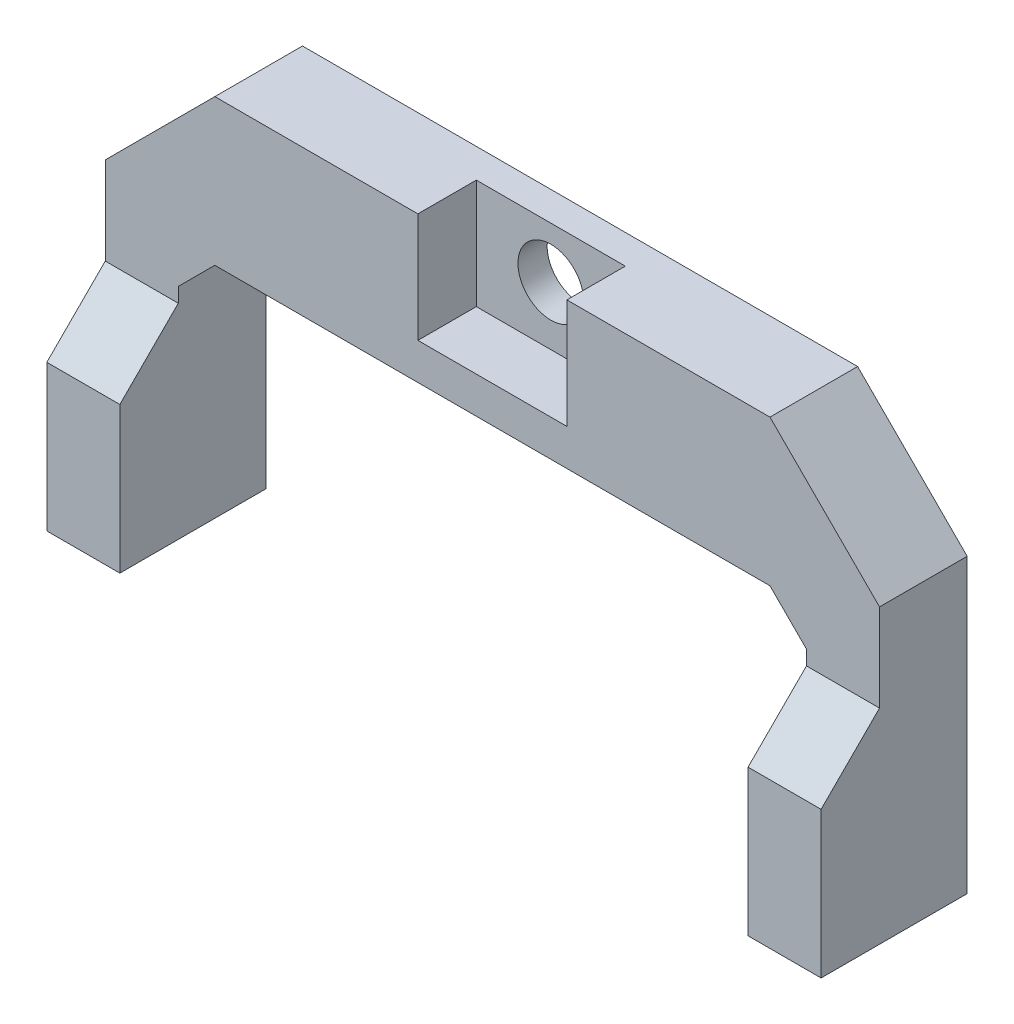
ISO-10303-21;
HEADER;
FILE_DESCRIPTION(('STEP AP214'),'2;1');
FILE_NAME('part.step','',(''),(''),'','','');
FILE_SCHEMA(('AUTOMOTIVE_DESIGN { 1 0 10303 214 1 1 1 1 }'));
ENDSEC;
DATA;
#1=APPLICATION_CONTEXT('core data for automotive mechanical design processes');
#2=APPLICATION_PROTOCOL_DEFINITION('international standard','automotive_design',2000,#1);
#3=PRODUCT_CONTEXT('',#1,'mechanical');
#4=PRODUCT('Part','Part','',(#3));
#5=PRODUCT_RELATED_PRODUCT_CATEGORY('part','',(#4));
#6=PRODUCT_DEFINITION_FORMATION('','',#4);
#7=PRODUCT_DEFINITION_CONTEXT('part definition',#1,'design');
#8=PRODUCT_DEFINITION('design','',#6,#7);
#9=PRODUCT_DEFINITION_SHAPE('','',#8);
#10=(LENGTH_UNIT() NAMED_UNIT(*) SI_UNIT(.MILLI.,.METRE.));
#11=(NAMED_UNIT(*) PLANE_ANGLE_UNIT() SI_UNIT($,.RADIAN.));
#12=(NAMED_UNIT(*) SI_UNIT($,.STERADIAN.) SOLID_ANGLE_UNIT());
#13=UNCERTAINTY_MEASURE_WITH_UNIT(LENGTH_MEASURE(1.E-05),#10,'distance_accuracy_value','');
#14=(GEOMETRIC_REPRESENTATION_CONTEXT(3) GLOBAL_UNCERTAINTY_ASSIGNED_CONTEXT((#13)) GLOBAL_UNIT_ASSIGNED_CONTEXT((#10,
#11,#12)) REPRESENTATION_CONTEXT('',''));
#15=CARTESIAN_POINT('',(0.,0.,0.));
#16=DIRECTION('',(0.,0.,1.));
#17=DIRECTION('',(1.,0.,0.));
#18=AXIS2_PLACEMENT_3D('',#15,#16,#17);
#19=CARTESIAN_POINT('',(-19.,0.,6.));
#20=DIRECTION('',(0.,-1.,0.));
#21=DIRECTION('',(0.,0.,-1.));
#22=AXIS2_PLACEMENT_3D('',#19,#20,#21);
#23=PLANE('',#22);
#24=DIRECTION('',(0.,0.,1.));
#25=VECTOR('',#24,1.);
#26=CARTESIAN_POINT('',(5.1,0.,2.));
#27=LINE('',#26,#25);
#28=CARTESIAN_POINT('',(5.1,0.,2.));
#29=VERTEX_POINT('',#28);
#30=CARTESIAN_POINT('',(5.1,0.,6.));
#31=VERTEX_POINT('',#30);
#32=EDGE_CURVE('E200',#29,#31,#27,.T.);
#33=ORIENTED_EDGE('',*,*,#32,.T.);
#34=DIRECTION('',(1.,0.,0.));
#35=VECTOR('',#34,1.);
#36=CARTESIAN_POINT('',(19.,0.,6.));
#37=LINE('',#36,#35);
#38=CARTESIAN_POINT('',(19.,0.,6.));
#39=VERTEX_POINT('',#38);
#40=EDGE_CURVE('E244',#31,#39,#37,.T.);
#41=ORIENTED_EDGE('',*,*,#40,.T.);
#42=DIRECTION('',(0.,0.,-1.));
#43=VECTOR('',#42,1.);
#44=CARTESIAN_POINT('',(19.,0.,6.));
#45=LINE('',#44,#43);
#46=CARTESIAN_POINT('',(19.,0.,0.));
#47=VERTEX_POINT('',#46);
#48=EDGE_CURVE('E247',#39,#47,#45,.T.);
#49=ORIENTED_EDGE('',*,*,#48,.T.);
#50=DIRECTION('',(-1.,0.,0.));
#51=VECTOR('',#50,1.);
#52=CARTESIAN_POINT('',(-19.,0.,0.));
#53=LINE('',#52,#51);
#54=CARTESIAN_POINT('',(-19.,0.,0.));
#55=VERTEX_POINT('',#54);
#56=EDGE_CURVE('E341',#47,#55,#53,.T.);
#57=ORIENTED_EDGE('',*,*,#56,.T.);
#58=DIRECTION('',(0.,0.,-1.));
#59=VECTOR('',#58,1.);
#60=CARTESIAN_POINT('',(-19.,0.,6.));
#61=LINE('',#60,#59);
#62=CARTESIAN_POINT('',(-19.,0.,6.));
#63=VERTEX_POINT('',#62);
#64=EDGE_CURVE('E377',#63,#55,#61,.T.);
#65=ORIENTED_EDGE('',*,*,#64,.F.);
#66=DIRECTION('',(-1.,0.,0.));
#67=VECTOR('',#66,1.);
#68=CARTESIAN_POINT('',(-19.,0.,6.));
#69=LINE('',#68,#67);
#70=CARTESIAN_POINT('',(-5.1,0.,6.));
#71=VERTEX_POINT('',#70);
#72=EDGE_CURVE('E321',#71,#63,#69,.T.);
#73=ORIENTED_EDGE('',*,*,#72,.F.);
#74=DIRECTION('',(0.,0.,1.));
#75=VECTOR('',#74,1.);
#76=CARTESIAN_POINT('',(-5.1,0.,2.));
#77=LINE('',#76,#75);
#78=CARTESIAN_POINT('',(-5.1,0.,2.));
#79=VERTEX_POINT('',#78);
#80=EDGE_CURVE('E191',#79,#71,#77,.T.);
#81=ORIENTED_EDGE('',*,*,#80,.F.);
#82=DIRECTION('',(-1.,0.,0.));
#83=VECTOR('',#82,1.);
#84=CARTESIAN_POINT('',(0.,0.,2.));
#85=LINE('',#84,#83);
#86=EDGE_CURVE('E286',#29,#79,#85,.T.);
#87=ORIENTED_EDGE('',*,*,#86,.F.);
#88=EDGE_LOOP('',(#33,#41,#49,#57,#65,#73,#81,#87));
#89=FACE_BOUND('',#88,.T.);
#90=ADVANCED_FACE('F41',(#89),#23,.F.);
#91=CARTESIAN_POINT('',(0.,0.,6.));
#92=DIRECTION('',(0.,0.,1.));
#93=DIRECTION('',(1.,0.,0.));
#94=AXIS2_PLACEMENT_3D('',#91,#92,#93);
#95=PLANE('',#94);
#96=DIRECTION('',(0.,1.,0.));
#97=VECTOR('',#96,1.);
#98=CARTESIAN_POINT('',(21.5,-12.5,6.));
#99=LINE('',#98,#97);
#100=CARTESIAN_POINT('',(21.5,-13.5,6.));
#101=VERTEX_POINT('',#100);
#102=CARTESIAN_POINT('',(21.5,-12.5,6.));
#103=VERTEX_POINT('',#102);
#104=EDGE_CURVE('E232',#101,#103,#99,.T.);
#105=ORIENTED_EDGE('',*,*,#104,.F.);
#106=DIRECTION('',(1.,0.,0.));
#107=VECTOR('',#106,1.);
#108=CARTESIAN_POINT('',(26.5,-13.5,6.));
#109=LINE('',#108,#107);
#110=CARTESIAN_POINT('',(26.5,-13.5,6.));
#111=VERTEX_POINT('',#110);
#112=EDGE_CURVE('E384',#101,#111,#109,.T.);
#113=ORIENTED_EDGE('',*,*,#112,.T.);
#114=DIRECTION('',(0.,-1.,0.));
#115=VECTOR('',#114,1.);
#116=CARTESIAN_POINT('',(26.5,-27.5,6.));
#117=LINE('',#116,#115);
#118=CARTESIAN_POINT('',(26.5,-7.49999999999998,6.));
#119=VERTEX_POINT('',#118);
#120=EDGE_CURVE('E236',#119,#111,#117,.T.);
#121=ORIENTED_EDGE('',*,*,#120,.F.);
#122=DIRECTION('',(0.707106781186549,-0.707106781186546,0.));
#123=VECTOR('',#122,1.);
#124=CARTESIAN_POINT('',(26.5,-7.49999999999998,6.));
#125=LINE('',#124,#123);
#126=EDGE_CURVE('E240',#39,#119,#125,.T.);
#127=ORIENTED_EDGE('',*,*,#126,.F.);
#128=ORIENTED_EDGE('',*,*,#40,.F.);
#129=DIRECTION('',(0.,-1.,0.));
#130=VECTOR('',#129,1.);
#131=CARTESIAN_POINT('',(5.1,0.,6.));
#132=LINE('',#131,#130);
#133=CARTESIAN_POINT('',(5.1,-7.5,6.));
#134=VERTEX_POINT('',#133);
#135=EDGE_CURVE('E202',#31,#134,#132,.T.);
#136=ORIENTED_EDGE('',*,*,#135,.T.);
#137=DIRECTION('',(1.,0.,0.));
#138=VECTOR('',#137,1.);
#139=CARTESIAN_POINT('',(0.,-7.5,6.));
#140=LINE('',#139,#138);
#141=CARTESIAN_POINT('',(-5.1,-7.5,6.));
#142=VERTEX_POINT('',#141);
#143=EDGE_CURVE('E206',#142,#134,#140,.T.);
#144=ORIENTED_EDGE('',*,*,#143,.F.);
#145=DIRECTION('',(0.,-1.,0.));
#146=VECTOR('',#145,1.);
#147=CARTESIAN_POINT('',(-5.1,0.,6.));
#148=LINE('',#147,#146);
#149=EDGE_CURVE('E285',#71,#142,#148,.T.);
#150=ORIENTED_EDGE('',*,*,#149,.F.);
#151=ORIENTED_EDGE('',*,*,#72,.T.);
#152=DIRECTION('',(-0.707106781186548,-0.707106781186547,0.));
#153=VECTOR('',#152,1.);
#154=CARTESIAN_POINT('',(-26.5,-7.49999999999999,6.));
#155=LINE('',#154,#153);
#156=CARTESIAN_POINT('',(-26.5,-7.49999999999999,6.));
#157=VERTEX_POINT('',#156);
#158=EDGE_CURVE('E325',#63,#157,#155,.T.);
#159=ORIENTED_EDGE('',*,*,#158,.T.);
#160=DIRECTION('',(0.,-1.,0.));
#161=VECTOR('',#160,1.);
#162=CARTESIAN_POINT('',(-26.5,-27.5,6.));
#163=LINE('',#162,#161);
#164=CARTESIAN_POINT('',(-26.5,-13.5,6.));
#165=VERTEX_POINT('',#164);
#166=EDGE_CURVE('E328',#157,#165,#163,.T.);
#167=ORIENTED_EDGE('',*,*,#166,.T.);
#168=DIRECTION('',(1.,0.,0.));
#169=VECTOR('',#168,1.);
#170=CARTESIAN_POINT('',(0.,-13.5,6.));
#171=LINE('',#170,#169);
#172=CARTESIAN_POINT('',(-21.5,-13.5,6.));
#173=VERTEX_POINT('',#172);
#174=EDGE_CURVE('E381',#165,#173,#171,.T.);
#175=ORIENTED_EDGE('',*,*,#174,.T.);
#176=DIRECTION('',(0.,1.,0.));
#177=VECTOR('',#176,1.);
#178=CARTESIAN_POINT('',(-21.5,-12.5,6.));
#179=LINE('',#178,#177);
#180=CARTESIAN_POINT('',(-21.5,-12.5,6.));
#181=VERTEX_POINT('',#180);
#182=EDGE_CURVE('E332',#173,#181,#179,.T.);
#183=ORIENTED_EDGE('',*,*,#182,.T.);
#184=DIRECTION('',(0.707106781186549,0.707106781186547,0.));
#185=VECTOR('',#184,1.);
#186=CARTESIAN_POINT('',(-19.,-10.,6.));
#187=LINE('',#186,#185);
#188=CARTESIAN_POINT('',(-19.,-10.,6.));
#189=VERTEX_POINT('',#188);
#190=EDGE_CURVE('E335',#181,#189,#187,.T.);
#191=ORIENTED_EDGE('',*,*,#190,.T.);
#192=DIRECTION('',(1.,0.,0.));
#193=VECTOR('',#192,1.);
#194=CARTESIAN_POINT('',(0.,-10.,6.));
#195=LINE('',#194,#193);
#196=CARTESIAN_POINT('',(19.,-10.,6.));
#197=VERTEX_POINT('',#196);
#198=EDGE_CURVE('E318',#189,#197,#195,.T.);
#199=ORIENTED_EDGE('',*,*,#198,.T.);
#200=DIRECTION('',(-0.707106781186549,0.707106781186546,0.));
#201=VECTOR('',#200,1.);
#202=CARTESIAN_POINT('',(19.,-10.,6.));
#203=LINE('',#202,#201);
#204=EDGE_CURVE('E228',#103,#197,#203,.T.);
#205=ORIENTED_EDGE('',*,*,#204,.F.);
#206=EDGE_LOOP('',(#105,#113,#121,#127,#128,#136,#144,#150,#151,#159,#167,#175,#183,#191,#199,#205));
#207=FACE_BOUND('',#206,.T.);
#208=ADVANCED_FACE('F399',(#207),#95,.T.);
#209=CARTESIAN_POINT('',(0.,-10.,6.));
#210=DIRECTION('',(0.,1.,0.));
#211=DIRECTION('',(-1.,0.,0.));
#212=AXIS2_PLACEMENT_3D('',#209,#210,#211);
#213=PLANE('',#212);
#214=DIRECTION('',(1.,0.,0.));
#215=VECTOR('',#214,1.);
#216=CARTESIAN_POINT('',(0.,-10.,0.));
#217=LINE('',#216,#215);
#218=CARTESIAN_POINT('',(-19.,-10.,0.));
#219=VERTEX_POINT('',#218);
#220=CARTESIAN_POINT('',(19.,-10.,0.));
#221=VERTEX_POINT('',#220);
#222=EDGE_CURVE('E317',#219,#221,#217,.T.);
#223=ORIENTED_EDGE('',*,*,#222,.T.);
#224=DIRECTION('',(0.,0.,-1.));
#225=VECTOR('',#224,1.);
#226=CARTESIAN_POINT('',(19.,-10.,6.));
#227=LINE('',#226,#225);
#228=EDGE_CURVE('E281',#197,#221,#227,.T.);
#229=ORIENTED_EDGE('',*,*,#228,.F.);
#230=ORIENTED_EDGE('',*,*,#198,.F.);
#231=DIRECTION('',(0.,0.,-1.));
#232=VECTOR('',#231,1.);
#233=CARTESIAN_POINT('',(-19.,-10.,6.));
#234=LINE('',#233,#232);
#235=EDGE_CURVE('E338',#189,#219,#234,.T.);
#236=ORIENTED_EDGE('',*,*,#235,.T.);
#237=EDGE_LOOP('',(#223,#229,#230,#236));
#238=FACE_BOUND('',#237,.T.);
#239=ADVANCED_FACE('F426',(#238),#213,.F.);
#240=CARTESIAN_POINT('',(-26.5,-7.49999999999999,6.));
#241=DIRECTION('',(0.707106781186547,-0.707106781186548,0.));
#242=DIRECTION('',(0.707106781186548,0.707106781186547,0.));
#243=AXIS2_PLACEMENT_3D('',#240,#241,#242);
#244=PLANE('',#243);
#245=DIRECTION('',(-0.707106781186548,-0.707106781186547,0.));
#246=VECTOR('',#245,1.);
#247=CARTESIAN_POINT('',(-26.5,-7.49999999999999,0.));
#248=LINE('',#247,#246);
#249=CARTESIAN_POINT('',(-26.5,-7.49999999999999,0.));
#250=VERTEX_POINT('',#249);
#251=EDGE_CURVE('E344',#55,#250,#248,.T.);
#252=ORIENTED_EDGE('',*,*,#251,.T.);
#253=DIRECTION('',(0.,0.,-1.));
#254=VECTOR('',#253,1.);
#255=CARTESIAN_POINT('',(-26.5,-7.49999999999999,6.));
#256=LINE('',#255,#254);
#257=EDGE_CURVE('E373',#157,#250,#256,.T.);
#258=ORIENTED_EDGE('',*,*,#257,.F.);
#259=ORIENTED_EDGE('',*,*,#158,.F.);
#260=ORIENTED_EDGE('',*,*,#64,.T.);
#261=EDGE_LOOP('',(#252,#258,#259,#260));
#262=FACE_BOUND('',#261,.T.);
#263=ADVANCED_FACE('F463',(#262),#244,.F.);
#264=CARTESIAN_POINT('',(-26.5,-27.5,6.));
#265=DIRECTION('',(1.,0.,0.));
#266=DIRECTION('',(0.,0.,-1.));
#267=AXIS2_PLACEMENT_3D('',#264,#265,#266);
#268=PLANE('',#267);
#269=DIRECTION('',(0.,-1.,0.));
#270=VECTOR('',#269,1.);
#271=CARTESIAN_POINT('',(-26.5,-27.5,0.));
#272=LINE('',#271,#270);
#273=CARTESIAN_POINT('',(-26.5,-27.5,0.));
#274=VERTEX_POINT('',#273);
#275=EDGE_CURVE('E347',#250,#274,#272,.T.);
#276=ORIENTED_EDGE('',*,*,#275,.T.);
#277=DIRECTION('',(0.,0.,-1.));
#278=VECTOR('',#277,1.);
#279=CARTESIAN_POINT('',(-26.5,-27.5,6.));
#280=LINE('',#279,#278);
#281=CARTESIAN_POINT('',(-26.5,-27.5,10.));
#282=VERTEX_POINT('',#281);
#283=EDGE_CURVE('E369',#282,#274,#280,.T.);
#284=ORIENTED_EDGE('',*,*,#283,.F.);
#285=DIRECTION('',(0.,-1.,0.));
#286=VECTOR('',#285,1.);
#287=CARTESIAN_POINT('',(-26.5,-27.5,10.));
#288=LINE('',#287,#286);
#289=CARTESIAN_POINT('',(-26.5,-17.5,10.));
#290=VERTEX_POINT('',#289);
#291=EDGE_CURVE('E299',#290,#282,#288,.T.);
#292=ORIENTED_EDGE('',*,*,#291,.F.);
#293=DIRECTION('',(0.,0.707106781186546,-0.707106781186549));
#294=VECTOR('',#293,1.);
#295=CARTESIAN_POINT('',(-26.5,-20.5,13.));
#296=LINE('',#295,#294);
#297=EDGE_CURVE('E51',#290,#165,#296,.T.);
#298=ORIENTED_EDGE('',*,*,#297,.T.);
#299=ORIENTED_EDGE('',*,*,#166,.F.);
#300=ORIENTED_EDGE('',*,*,#257,.T.);
#301=EDGE_LOOP('',(#276,#284,#292,#298,#299,#300));
#302=FACE_BOUND('',#301,.T.);
#303=ADVANCED_FACE('F394',(#302),#268,.F.);
#304=CARTESIAN_POINT('',(-21.5,-27.5,6.));
#305=DIRECTION('',(0.,1.,0.));
#306=DIRECTION('',(-1.,0.,0.));
#307=AXIS2_PLACEMENT_3D('',#304,#305,#306);
#308=PLANE('',#307);
#309=DIRECTION('',(1.,0.,0.));
#310=VECTOR('',#309,1.);
#311=CARTESIAN_POINT('',(-21.5,-27.5,0.));
#312=LINE('',#311,#310);
#313=CARTESIAN_POINT('',(-21.5,-27.5,0.));
#314=VERTEX_POINT('',#313);
#315=EDGE_CURVE('E350',#274,#314,#312,.T.);
#316=ORIENTED_EDGE('',*,*,#315,.T.);
#317=DIRECTION('',(0.,0.,-1.));
#318=VECTOR('',#317,1.);
#319=CARTESIAN_POINT('',(-21.5,-27.5,6.));
#320=LINE('',#319,#318);
#321=CARTESIAN_POINT('',(-21.5,-27.5,10.));
#322=VERTEX_POINT('',#321);
#323=EDGE_CURVE('E365',#322,#314,#320,.T.);
#324=ORIENTED_EDGE('',*,*,#323,.F.);
#325=DIRECTION('',(1.,0.,0.));
#326=VECTOR('',#325,1.);
#327=CARTESIAN_POINT('',(-26.5,-27.5,10.));
#328=LINE('',#327,#326);
#329=EDGE_CURVE('E305',#282,#322,#328,.T.);
#330=ORIENTED_EDGE('',*,*,#329,.F.);
#331=ORIENTED_EDGE('',*,*,#283,.T.);
#332=EDGE_LOOP('',(#316,#324,#330,#331));
#333=FACE_BOUND('',#332,.T.);
#334=ADVANCED_FACE('F412',(#333),#308,.F.);
#335=CARTESIAN_POINT('',(-21.5,-12.5,6.));
#336=DIRECTION('',(-1.,0.,0.));
#337=DIRECTION('',(0.,-1.,0.));
#338=AXIS2_PLACEMENT_3D('',#335,#336,#337);
#339=PLANE('',#338);
#340=DIRECTION('',(0.,1.,0.));
#341=VECTOR('',#340,1.);
#342=CARTESIAN_POINT('',(-21.5,-12.5,0.));
#343=LINE('',#342,#341);
#344=CARTESIAN_POINT('',(-21.5,-12.5,0.));
#345=VERTEX_POINT('',#344);
#346=EDGE_CURVE('E353',#314,#345,#343,.T.);
#347=ORIENTED_EDGE('',*,*,#346,.T.);
#348=DIRECTION('',(0.,0.,-1.));
#349=VECTOR('',#348,1.);
#350=CARTESIAN_POINT('',(-21.5,-12.5,6.));
#351=LINE('',#350,#349);
#352=EDGE_CURVE('E361',#181,#345,#351,.T.);
#353=ORIENTED_EDGE('',*,*,#352,.F.);
#354=ORIENTED_EDGE('',*,*,#182,.F.);
#355=DIRECTION('',(0.,-0.707106781186546,0.707106781186549));
#356=VECTOR('',#355,1.);
#357=CARTESIAN_POINT('',(-21.5,-13.,5.49999999999999));
#358=LINE('',#357,#356);
#359=CARTESIAN_POINT('',(-21.5,-17.5,10.));
#360=VERTEX_POINT('',#359);
#361=EDGE_CURVE('E11',#173,#360,#358,.T.);
#362=ORIENTED_EDGE('',*,*,#361,.T.);
#363=DIRECTION('',(0.,1.,0.));
#364=VECTOR('',#363,1.);
#365=CARTESIAN_POINT('',(-21.5,-27.5,10.));
#366=LINE('',#365,#364);
#367=EDGE_CURVE('E309',#322,#360,#366,.T.);
#368=ORIENTED_EDGE('',*,*,#367,.F.);
#369=ORIENTED_EDGE('',*,*,#323,.T.);
#370=EDGE_LOOP('',(#347,#353,#354,#362,#368,#369));
#371=FACE_BOUND('',#370,.T.);
#372=ADVANCED_FACE('F406',(#371),#339,.F.);
#373=CARTESIAN_POINT('',(-19.,-10.,6.));
#374=DIRECTION('',(-0.707106781186546,0.707106781186548,0.));
#375=DIRECTION('',(-0.707106781186549,-0.707106781186547,0.));
#376=AXIS2_PLACEMENT_3D('',#373,#374,#375);
#377=PLANE('',#376);
#378=DIRECTION('',(0.707106781186549,0.707106781186547,0.));
#379=VECTOR('',#378,1.);
#380=CARTESIAN_POINT('',(-19.,-10.,0.));
#381=LINE('',#380,#379);
#382=EDGE_CURVE('E322',#345,#219,#381,.T.);
#383=ORIENTED_EDGE('',*,*,#382,.T.);
#384=ORIENTED_EDGE('',*,*,#235,.F.);
#385=ORIENTED_EDGE('',*,*,#190,.F.);
#386=ORIENTED_EDGE('',*,*,#352,.T.);
#387=EDGE_LOOP('',(#383,#384,#385,#386));
#388=FACE_BOUND('',#387,.T.);
#389=ADVANCED_FACE('F422',(#388),#377,.F.);
#390=CARTESIAN_POINT('',(0.,0.,0.));
#391=DIRECTION('',(0.,0.,1.));
#392=DIRECTION('',(1.,0.,0.));
#393=AXIS2_PLACEMENT_3D('',#390,#391,#392);
#394=PLANE('',#393);
#395=CARTESIAN_POINT('',(0.,-3.5,0.));
#396=DIRECTION('',(0.,0.,1.));
#397=DIRECTION('',(1.,0.,0.));
#398=AXIS2_PLACEMENT_3D('',#395,#396,#397);
#399=CIRCLE('',#398,2.24999999999999);
#400=CARTESIAN_POINT('',(2.24999999999999,-3.5,0.));
#401=VERTEX_POINT('',#400);
#402=EDGE_CURVE('E692',#401,#401,#399,.T.);
#403=ORIENTED_EDGE('',*,*,#402,.T.);
#404=EDGE_LOOP('',(#403));
#405=FACE_BOUND('',#404,.T.);
#406=ORIENTED_EDGE('',*,*,#222,.F.);
#407=ORIENTED_EDGE('',*,*,#382,.F.);
#408=ORIENTED_EDGE('',*,*,#346,.F.);
#409=ORIENTED_EDGE('',*,*,#315,.F.);
#410=ORIENTED_EDGE('',*,*,#275,.F.);
#411=ORIENTED_EDGE('',*,*,#251,.F.);
#412=ORIENTED_EDGE('',*,*,#56,.F.);
#413=DIRECTION('',(0.707106781186549,-0.707106781186546,0.));
#414=VECTOR('',#413,1.);
#415=CARTESIAN_POINT('',(26.5,-7.49999999999998,0.));
#416=LINE('',#415,#414);
#417=CARTESIAN_POINT('',(26.5,-7.49999999999998,0.));
#418=VERTEX_POINT('',#417);
#419=EDGE_CURVE('E233',#47,#418,#416,.T.);
#420=ORIENTED_EDGE('',*,*,#419,.T.);
#421=DIRECTION('',(0.,-1.,0.));
#422=VECTOR('',#421,1.);
#423=CARTESIAN_POINT('',(26.5,-27.5,0.));
#424=LINE('',#423,#422);
#425=CARTESIAN_POINT('',(26.5,-27.5,0.));
#426=VERTEX_POINT('',#425);
#427=EDGE_CURVE('E259',#418,#426,#424,.T.);
#428=ORIENTED_EDGE('',*,*,#427,.T.);
#429=DIRECTION('',(-1.,0.,0.));
#430=VECTOR('',#429,1.);
#431=CARTESIAN_POINT('',(21.5,-27.5,0.));
#432=LINE('',#431,#430);
#433=CARTESIAN_POINT('',(21.5,-27.5,0.));
#434=VERTEX_POINT('',#433);
#435=EDGE_CURVE('E255',#426,#434,#432,.T.);
#436=ORIENTED_EDGE('',*,*,#435,.T.);
#437=DIRECTION('',(0.,1.,0.));
#438=VECTOR('',#437,1.);
#439=CARTESIAN_POINT('',(21.5,-12.5,0.));
#440=LINE('',#439,#438);
#441=CARTESIAN_POINT('',(21.5,-12.5,0.));
#442=VERTEX_POINT('',#441);
#443=EDGE_CURVE('E251',#434,#442,#440,.T.);
#444=ORIENTED_EDGE('',*,*,#443,.T.);
#445=DIRECTION('',(-0.707106781186549,0.707106781186546,0.));
#446=VECTOR('',#445,1.);
#447=CARTESIAN_POINT('',(19.,-10.,0.));
#448=LINE('',#447,#446);
#449=EDGE_CURVE('E227',#442,#221,#448,.T.);
#450=ORIENTED_EDGE('',*,*,#449,.T.);
#451=EDGE_LOOP('',(#406,#407,#408,#409,#410,#411,#412,#420,#428,#436,#444,#450));
#452=FACE_BOUND('',#451,.T.);
#453=ADVANCED_FACE('F418',(#405,#452),#394,.F.);
#454=CARTESIAN_POINT('',(0.,0.,10.));
#455=DIRECTION('',(0.,0.,-1.));
#456=DIRECTION('',(-1.,0.,0.));
#457=AXIS2_PLACEMENT_3D('',#454,#455,#456);
#458=PLANE('',#457);
#459=ORIENTED_EDGE('',*,*,#291,.T.);
#460=ORIENTED_EDGE('',*,*,#329,.T.);
#461=ORIENTED_EDGE('',*,*,#367,.T.);
#462=DIRECTION('',(-1.,0.,0.));
#463=VECTOR('',#462,1.);
#464=CARTESIAN_POINT('',(-26.5,-17.5,10.));
#465=LINE('',#464,#463);
#466=EDGE_CURVE('E313',#360,#290,#465,.T.);
#467=ORIENTED_EDGE('',*,*,#466,.T.);
#468=EDGE_LOOP('',(#459,#460,#461,#467));
#469=FACE_BOUND('',#468,.T.);
#470=ADVANCED_FACE('F409',(#469),#458,.F.);
#471=CARTESIAN_POINT('',(0.,-7.5,2.));
#472=DIRECTION('',(0.,-1.,0.));
#473=DIRECTION('',(1.,0.,0.));
#474=AXIS2_PLACEMENT_3D('',#471,#472,#473);
#475=PLANE('',#474);
#476=ORIENTED_EDGE('',*,*,#143,.T.);
#477=DIRECTION('',(0.,0.,1.));
#478=VECTOR('',#477,1.);
#479=CARTESIAN_POINT('',(5.1,-7.5,2.));
#480=LINE('',#479,#478);
#481=CARTESIAN_POINT('',(5.1,-7.5,2.));
#482=VERTEX_POINT('',#481);
#483=EDGE_CURVE('E197',#482,#134,#480,.T.);
#484=ORIENTED_EDGE('',*,*,#483,.F.);
#485=DIRECTION('',(1.,0.,0.));
#486=VECTOR('',#485,1.);
#487=CARTESIAN_POINT('',(0.,-7.5,2.));
#488=LINE('',#487,#486);
#489=CARTESIAN_POINT('',(-5.1,-7.5,2.));
#490=VERTEX_POINT('',#489);
#491=EDGE_CURVE('E182',#490,#482,#488,.T.);
#492=ORIENTED_EDGE('',*,*,#491,.F.);
#493=DIRECTION('',(0.,0.,1.));
#494=VECTOR('',#493,1.);
#495=CARTESIAN_POINT('',(-5.1,-7.5,2.));
#496=LINE('',#495,#494);
#497=EDGE_CURVE('E296',#490,#142,#496,.T.);
#498=ORIENTED_EDGE('',*,*,#497,.T.);
#499=EDGE_LOOP('',(#476,#484,#492,#498));
#500=FACE_BOUND('',#499,.T.);
#501=ADVANCED_FACE('F204',(#500),#475,.F.);
#502=CARTESIAN_POINT('',(-5.1,0.,2.));
#503=DIRECTION('',(-1.,0.,0.));
#504=DIRECTION('',(0.,-1.,0.));
#505=AXIS2_PLACEMENT_3D('',#502,#503,#504);
#506=PLANE('',#505);
#507=ORIENTED_EDGE('',*,*,#149,.T.);
#508=ORIENTED_EDGE('',*,*,#497,.F.);
#509=DIRECTION('',(0.,-1.,0.));
#510=VECTOR('',#509,1.);
#511=CARTESIAN_POINT('',(-5.1,0.,2.));
#512=LINE('',#511,#510);
#513=EDGE_CURVE('E187',#79,#490,#512,.T.);
#514=ORIENTED_EDGE('',*,*,#513,.F.);
#515=ORIENTED_EDGE('',*,*,#80,.T.);
#516=EDGE_LOOP('',(#507,#508,#514,#515));
#517=FACE_BOUND('',#516,.T.);
#518=ADVANCED_FACE('F460',(#517),#506,.F.);
#519=CARTESIAN_POINT('',(0.,0.,2.));
#520=DIRECTION('',(0.,0.,-1.));
#521=DIRECTION('',(-1.,0.,0.));
#522=AXIS2_PLACEMENT_3D('',#519,#520,#521);
#523=PLANE('',#522);
#524=CARTESIAN_POINT('',(0.,-3.5,2.));
#525=DIRECTION('',(0.,0.,1.));
#526=DIRECTION('',(1.,0.,0.));
#527=AXIS2_PLACEMENT_3D('',#524,#525,#526);
#528=CIRCLE('',#527,2.24999999999999);
#529=CARTESIAN_POINT('',(2.24999999999999,-3.5,2.));
#530=VERTEX_POINT('',#529);
#531=EDGE_CURVE('E694',#530,#530,#528,.T.);
#532=ORIENTED_EDGE('',*,*,#531,.F.);
#533=EDGE_LOOP('',(#532));
#534=FACE_BOUND('',#533,.T.);
#535=ORIENTED_EDGE('',*,*,#491,.T.);
#536=DIRECTION('',(0.,-1.,0.));
#537=VECTOR('',#536,1.);
#538=CARTESIAN_POINT('',(5.1,0.,2.));
#539=LINE('',#538,#537);
#540=EDGE_CURVE('E186',#29,#482,#539,.T.);
#541=ORIENTED_EDGE('',*,*,#540,.F.);
#542=ORIENTED_EDGE('',*,*,#86,.T.);
#543=ORIENTED_EDGE('',*,*,#513,.T.);
#544=EDGE_LOOP('',(#535,#541,#542,#543));
#545=FACE_BOUND('',#544,.T.);
#546=ADVANCED_FACE('F184',(#534,#545),#523,.F.);
#547=CARTESIAN_POINT('',(19.,-10.,6.));
#548=DIRECTION('',(-0.707106781186546,-0.707106781186549,0.));
#549=DIRECTION('',(0.707106781186549,-0.707106781186546,0.));
#550=AXIS2_PLACEMENT_3D('',#547,#548,#549);
#551=PLANE('',#550);
#552=ORIENTED_EDGE('',*,*,#449,.F.);
#553=DIRECTION('',(0.,0.,-1.));
#554=VECTOR('',#553,1.);
#555=CARTESIAN_POINT('',(21.5,-12.5,6.));
#556=LINE('',#555,#554);
#557=EDGE_CURVE('E278',#103,#442,#556,.T.);
#558=ORIENTED_EDGE('',*,*,#557,.F.);
#559=ORIENTED_EDGE('',*,*,#204,.T.);
#560=ORIENTED_EDGE('',*,*,#228,.T.);
#561=EDGE_LOOP('',(#552,#558,#559,#560));
#562=FACE_BOUND('',#561,.T.);
#563=ADVANCED_FACE('F432',(#562),#551,.T.);
#564=CARTESIAN_POINT('',(21.5,-12.5,6.));
#565=DIRECTION('',(-1.,0.,0.));
#566=DIRECTION('',(0.,-1.,0.));
#567=AXIS2_PLACEMENT_3D('',#564,#565,#566);
#568=PLANE('',#567);
#569=ORIENTED_EDGE('',*,*,#443,.F.);
#570=DIRECTION('',(0.,0.,-1.));
#571=VECTOR('',#570,1.);
#572=CARTESIAN_POINT('',(21.5,-27.5,6.));
#573=LINE('',#572,#571);
#574=CARTESIAN_POINT('',(21.5,-27.5,10.));
#575=VERTEX_POINT('',#574);
#576=EDGE_CURVE('E275',#575,#434,#573,.T.);
#577=ORIENTED_EDGE('',*,*,#576,.F.);
#578=DIRECTION('',(0.,1.,0.));
#579=VECTOR('',#578,1.);
#580=CARTESIAN_POINT('',(21.5,-27.5,10.));
#581=LINE('',#580,#579);
#582=CARTESIAN_POINT('',(21.5,-17.5,10.));
#583=VERTEX_POINT('',#582);
#584=EDGE_CURVE('E220',#575,#583,#581,.T.);
#585=ORIENTED_EDGE('',*,*,#584,.T.);
#586=DIRECTION('',(0.,-0.707106781186547,0.707106781186548));
#587=VECTOR('',#586,1.);
#588=CARTESIAN_POINT('',(21.5,-13.5,6.));
#589=LINE('',#588,#587);
#590=EDGE_CURVE('E66',#583,#101,#589,.F.);
#591=ORIENTED_EDGE('',*,*,#590,.T.);
#592=ORIENTED_EDGE('',*,*,#104,.T.);
#593=ORIENTED_EDGE('',*,*,#557,.T.);
#594=EDGE_LOOP('',(#569,#577,#585,#591,#592,#593));
#595=FACE_BOUND('',#594,.T.);
#596=ADVANCED_FACE('F434',(#595),#568,.T.);
#597=CARTESIAN_POINT('',(21.5,-27.5,6.));
#598=DIRECTION('',(0.,-1.,0.));
#599=DIRECTION('',(1.,0.,0.));
#600=AXIS2_PLACEMENT_3D('',#597,#598,#599);
#601=PLANE('',#600);
#602=ORIENTED_EDGE('',*,*,#435,.F.);
#603=DIRECTION('',(0.,0.,-1.));
#604=VECTOR('',#603,1.);
#605=CARTESIAN_POINT('',(26.5,-27.5,6.));
#606=LINE('',#605,#604);
#607=CARTESIAN_POINT('',(26.5,-27.5,10.));
#608=VERTEX_POINT('',#607);
#609=EDGE_CURVE('E272',#608,#426,#606,.T.);
#610=ORIENTED_EDGE('',*,*,#609,.F.);
#611=DIRECTION('',(-1.,0.,0.));
#612=VECTOR('',#611,1.);
#613=CARTESIAN_POINT('',(26.5,-27.5,10.));
#614=LINE('',#613,#612);
#615=EDGE_CURVE('E223',#608,#575,#614,.T.);
#616=ORIENTED_EDGE('',*,*,#615,.T.);
#617=ORIENTED_EDGE('',*,*,#576,.T.);
#618=EDGE_LOOP('',(#602,#610,#616,#617));
#619=FACE_BOUND('',#618,.T.);
#620=ADVANCED_FACE('F439',(#619),#601,.T.);
#621=CARTESIAN_POINT('',(26.5,-27.5,6.));
#622=DIRECTION('',(1.,0.,0.));
#623=DIRECTION('',(0.,1.,0.));
#624=AXIS2_PLACEMENT_3D('',#621,#622,#623);
#625=PLANE('',#624);
#626=ORIENTED_EDGE('',*,*,#427,.F.);
#627=DIRECTION('',(0.,0.,-1.));
#628=VECTOR('',#627,1.);
#629=CARTESIAN_POINT('',(26.5,-7.49999999999998,6.));
#630=LINE('',#629,#628);
#631=EDGE_CURVE('E269',#119,#418,#630,.T.);
#632=ORIENTED_EDGE('',*,*,#631,.F.);
#633=ORIENTED_EDGE('',*,*,#120,.T.);
#634=DIRECTION('',(0.,0.707106781186547,-0.707106781186548));
#635=VECTOR('',#634,1.);
#636=CARTESIAN_POINT('',(26.5,-13.5,6.));
#637=LINE('',#636,#635);
#638=CARTESIAN_POINT('',(26.5,-17.5,10.));
#639=VERTEX_POINT('',#638);
#640=EDGE_CURVE('E58',#111,#639,#637,.F.);
#641=ORIENTED_EDGE('',*,*,#640,.T.);
#642=DIRECTION('',(0.,-1.,0.));
#643=VECTOR('',#642,1.);
#644=CARTESIAN_POINT('',(26.5,-27.5,10.));
#645=LINE('',#644,#643);
#646=EDGE_CURVE('E210',#639,#608,#645,.T.);
#647=ORIENTED_EDGE('',*,*,#646,.T.);
#648=ORIENTED_EDGE('',*,*,#609,.T.);
#649=EDGE_LOOP('',(#626,#632,#633,#641,#647,#648));
#650=FACE_BOUND('',#649,.T.);
#651=ADVANCED_FACE('F448',(#650),#625,.T.);
#652=CARTESIAN_POINT('',(26.5,-7.49999999999998,6.));
#653=DIRECTION('',(0.707106781186546,0.707106781186549,0.));
#654=DIRECTION('',(-0.707106781186549,0.707106781186546,0.));
#655=AXIS2_PLACEMENT_3D('',#652,#653,#654);
#656=PLANE('',#655);
#657=ORIENTED_EDGE('',*,*,#419,.F.);
#658=ORIENTED_EDGE('',*,*,#48,.F.);
#659=ORIENTED_EDGE('',*,*,#126,.T.);
#660=ORIENTED_EDGE('',*,*,#631,.T.);
#661=EDGE_LOOP('',(#657,#658,#659,#660));
#662=FACE_BOUND('',#661,.T.);
#663=ADVANCED_FACE('F451',(#662),#656,.T.);
#664=CARTESIAN_POINT('',(0.,0.,10.));
#665=DIRECTION('',(0.,0.,-1.));
#666=DIRECTION('',(1.,0.,0.));
#667=AXIS2_PLACEMENT_3D('',#664,#665,#666);
#668=PLANE('',#667);
#669=ORIENTED_EDGE('',*,*,#646,.F.);
#670=DIRECTION('',(1.,0.,0.));
#671=VECTOR('',#670,1.);
#672=CARTESIAN_POINT('',(26.5,-17.5,10.));
#673=LINE('',#672,#671);
#674=EDGE_CURVE('E217',#583,#639,#673,.T.);
#675=ORIENTED_EDGE('',*,*,#674,.F.);
#676=ORIENTED_EDGE('',*,*,#584,.F.);
#677=ORIENTED_EDGE('',*,*,#615,.F.);
#678=EDGE_LOOP('',(#669,#675,#676,#677));
#679=FACE_BOUND('',#678,.T.);
#680=ADVANCED_FACE('F443',(#679),#668,.F.);
#681=CARTESIAN_POINT('',(5.1,0.,2.));
#682=DIRECTION('',(-1.,0.,0.));
#683=DIRECTION('',(0.,-1.,0.));
#684=AXIS2_PLACEMENT_3D('',#681,#682,#683);
#685=PLANE('',#684);
#686=ORIENTED_EDGE('',*,*,#135,.F.);
#687=ORIENTED_EDGE('',*,*,#32,.F.);
#688=ORIENTED_EDGE('',*,*,#540,.T.);
#689=ORIENTED_EDGE('',*,*,#483,.T.);
#690=EDGE_LOOP('',(#686,#687,#688,#689));
#691=FACE_BOUND('',#690,.T.);
#692=ADVANCED_FACE('F196',(#691),#685,.T.);
#693=CARTESIAN_POINT('',(0.,-3.5,2.));
#694=DIRECTION('',(0.,0.,1.));
#695=DIRECTION('',(1.,0.,0.));
#696=AXIS2_PLACEMENT_3D('',#693,#694,#695);
#697=CYLINDRICAL_SURFACE('',#696,2.24999999999999);
#698=ORIENTED_EDGE('',*,*,#402,.F.);
#699=EDGE_LOOP('',(#698));
#700=FACE_BOUND('',#699,.T.);
#701=ORIENTED_EDGE('',*,*,#531,.T.);
#702=EDGE_LOOP('',(#701));
#703=FACE_BOUND('',#702,.T.);
#704=ADVANCED_FACE('F482',(#700,#703),#697,.F.);
#705=CARTESIAN_POINT('',(0.,-13.5,6.));
#706=DIRECTION('',(0.,0.707106781186548,0.707106781186547));
#707=DIRECTION('',(-1.,0.,0.));
#708=AXIS2_PLACEMENT_3D('',#705,#706,#707);
#709=PLANE('',#708);
#710=ORIENTED_EDGE('',*,*,#590,.F.);
#711=ORIENTED_EDGE('',*,*,#674,.T.);
#712=ORIENTED_EDGE('',*,*,#640,.F.);
#713=ORIENTED_EDGE('',*,*,#112,.F.);
#714=EDGE_LOOP('',(#710,#711,#712,#713));
#715=FACE_BOUND('',#714,.T.);
#716=ADVANCED_FACE('F444',(#715),#709,.T.);
#717=CARTESIAN_POINT('',(-26.5,-17.5,10.));
#718=DIRECTION('',(0.,-0.707106781186549,-0.707106781186546));
#719=DIRECTION('',(-1.,0.,0.));
#720=AXIS2_PLACEMENT_3D('',#717,#718,#719);
#721=PLANE('',#720);
#722=ORIENTED_EDGE('',*,*,#361,.F.);
#723=ORIENTED_EDGE('',*,*,#174,.F.);
#724=ORIENTED_EDGE('',*,*,#297,.F.);
#725=ORIENTED_EDGE('',*,*,#466,.F.);
#726=EDGE_LOOP('',(#722,#723,#724,#725));
#727=FACE_BOUND('',#726,.T.);
#728=ADVANCED_FACE('F44',(#727),#721,.F.);
#729=CLOSED_SHELL('',(#90,#208,#239,#263,#303,#334,#372,#389,#453,#470,#501,#518,#546,#563,#596,
#620,#651,#663,#680,#692,#704,#716,#728));
#730=MANIFOLD_SOLID_BREP('B2',#729);
#731=ADVANCED_BREP_SHAPE_REPRESENTATION('',(#18,#730),#14);
#732=SHAPE_DEFINITION_REPRESENTATION(#9,#731);
ENDSEC;
END-ISO-10303-21;
